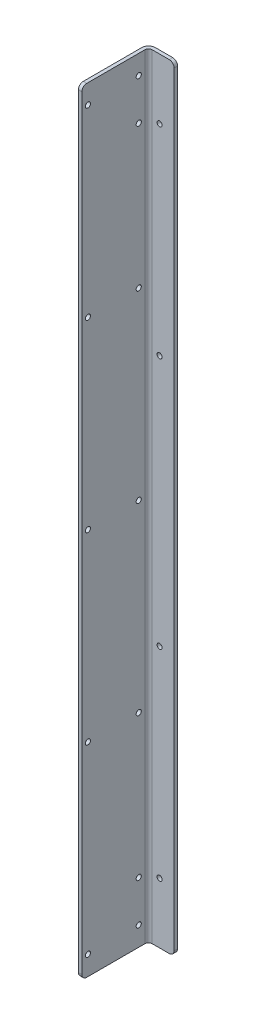
ISO-10303-21;
HEADER;
FILE_DESCRIPTION(('STEP AP214'),'2;1');
FILE_NAME('part.step','',(''),(''),'','','');
FILE_SCHEMA(('AUTOMOTIVE_DESIGN { 1 0 10303 214 1 1 1 1 }'));
ENDSEC;
DATA;
#1=APPLICATION_CONTEXT('core data for automotive mechanical design processes');
#2=APPLICATION_PROTOCOL_DEFINITION('international standard','automotive_design',2000,#1);
#3=PRODUCT_CONTEXT('',#1,'mechanical');
#4=PRODUCT('Part','Part','',(#3));
#5=PRODUCT_RELATED_PRODUCT_CATEGORY('part','',(#4));
#6=PRODUCT_DEFINITION_FORMATION('','',#4);
#7=PRODUCT_DEFINITION_CONTEXT('part definition',#1,'design');
#8=PRODUCT_DEFINITION('design','',#6,#7);
#9=PRODUCT_DEFINITION_SHAPE('','',#8);
#10=(LENGTH_UNIT() NAMED_UNIT(*) SI_UNIT(.MILLI.,.METRE.));
#11=(NAMED_UNIT(*) PLANE_ANGLE_UNIT() SI_UNIT($,.RADIAN.));
#12=(NAMED_UNIT(*) SI_UNIT($,.STERADIAN.) SOLID_ANGLE_UNIT());
#13=UNCERTAINTY_MEASURE_WITH_UNIT(LENGTH_MEASURE(1.E-05),#10,'distance_accuracy_value','');
#14=(GEOMETRIC_REPRESENTATION_CONTEXT(3) GLOBAL_UNCERTAINTY_ASSIGNED_CONTEXT((#13)) GLOBAL_UNIT_ASSIGNED_CONTEXT((#10,
#11,#12)) REPRESENTATION_CONTEXT('',''));
#15=CARTESIAN_POINT('',(0.,0.,0.));
#16=DIRECTION('',(0.,0.,1.));
#17=DIRECTION('',(1.,0.,0.));
#18=AXIS2_PLACEMENT_3D('',#15,#16,#17);
#19=CARTESIAN_POINT('',(19.05,165.1,0.));
#20=DIRECTION('',(0.,0.,-1.));
#21=DIRECTION('',(-1.,0.,0.));
#22=AXIS2_PLACEMENT_3D('',#19,#20,#21);
#23=CYLINDRICAL_SURFACE('',#22,3.3655);
#24=CARTESIAN_POINT('',(19.05,165.1,4.55422));
#25=DIRECTION('',(0.,0.,-1.));
#26=DIRECTION('',(-1.,0.,0.));
#27=AXIS2_PLACEMENT_3D('',#24,#25,#26);
#28=CIRCLE('',#27,3.3655);
#29=CARTESIAN_POINT('',(15.6845,165.1,4.55422));
#30=VERTEX_POINT('',#29);
#31=EDGE_CURVE('E249',#30,#30,#28,.T.);
#32=ORIENTED_EDGE('',*,*,#31,.F.);
#33=EDGE_LOOP('',(#32));
#34=FACE_BOUND('',#33,.T.);
#35=CARTESIAN_POINT('',(19.05,165.1,0.));
#36=DIRECTION('',(0.,0.,-1.));
#37=DIRECTION('',(-1.,0.,0.));
#38=AXIS2_PLACEMENT_3D('',#35,#36,#37);
#39=CIRCLE('',#38,3.3655);
#40=CARTESIAN_POINT('',(15.6845,165.1,0.));
#41=VERTEX_POINT('',#40);
#42=EDGE_CURVE('E120',#41,#41,#39,.F.);
#43=ORIENTED_EDGE('',*,*,#42,.F.);
#44=EDGE_LOOP('',(#43));
#45=FACE_BOUND('',#44,.T.);
#46=ADVANCED_FACE('F17',(#34,#45),#23,.F.);
#47=CARTESIAN_POINT('',(19.05,428.625,0.));
#48=DIRECTION('',(0.,0.,1.));
#49=DIRECTION('',(1.,0.,0.));
#50=AXIS2_PLACEMENT_3D('',#47,#48,#49);
#51=CYLINDRICAL_SURFACE('',#50,3.3655);
#52=CARTESIAN_POINT('',(19.05,428.625,0.));
#53=DIRECTION('',(0.,0.,1.));
#54=DIRECTION('',(1.,0.,0.));
#55=AXIS2_PLACEMENT_3D('',#52,#53,#54);
#56=CIRCLE('',#55,3.3655);
#57=CARTESIAN_POINT('',(22.4155,428.625,0.));
#58=VERTEX_POINT('',#57);
#59=EDGE_CURVE('E260',#58,#58,#56,.T.);
#60=ORIENTED_EDGE('',*,*,#59,.F.);
#61=EDGE_LOOP('',(#60));
#62=FACE_BOUND('',#61,.T.);
#63=CARTESIAN_POINT('',(19.05,428.625,4.55422));
#64=DIRECTION('',(0.,0.,1.));
#65=DIRECTION('',(1.,0.,0.));
#66=AXIS2_PLACEMENT_3D('',#63,#64,#65);
#67=CIRCLE('',#66,3.3655);
#68=CARTESIAN_POINT('',(22.4155,428.625,4.55422));
#69=VERTEX_POINT('',#68);
#70=EDGE_CURVE('E246',#69,#69,#67,.F.);
#71=ORIENTED_EDGE('',*,*,#70,.F.);
#72=EDGE_LOOP('',(#71));
#73=FACE_BOUND('',#72,.T.);
#74=ADVANCED_FACE('F267',(#62,#73),#51,.F.);
#75=CARTESIAN_POINT('',(19.05,-165.1,0.));
#76=DIRECTION('',(0.,0.,1.));
#77=DIRECTION('',(1.,0.,0.));
#78=AXIS2_PLACEMENT_3D('',#75,#76,#77);
#79=CYLINDRICAL_SURFACE('',#78,3.3655);
#80=CARTESIAN_POINT('',(19.05,-165.1,0.));
#81=DIRECTION('',(0.,0.,1.));
#82=DIRECTION('',(1.,0.,0.));
#83=AXIS2_PLACEMENT_3D('',#80,#81,#82);
#84=CIRCLE('',#83,3.3655);
#85=CARTESIAN_POINT('',(22.4155,-165.1,0.));
#86=VERTEX_POINT('',#85);
#87=EDGE_CURVE('E257',#86,#86,#84,.T.);
#88=ORIENTED_EDGE('',*,*,#87,.F.);
#89=EDGE_LOOP('',(#88));
#90=FACE_BOUND('',#89,.T.);
#91=CARTESIAN_POINT('',(19.05,-165.1,4.55422));
#92=DIRECTION('',(0.,0.,1.));
#93=DIRECTION('',(1.,0.,0.));
#94=AXIS2_PLACEMENT_3D('',#91,#92,#93);
#95=CIRCLE('',#94,3.3655);
#96=CARTESIAN_POINT('',(22.4155,-165.1,4.55422));
#97=VERTEX_POINT('',#96);
#98=EDGE_CURVE('E243',#97,#97,#95,.F.);
#99=ORIENTED_EDGE('',*,*,#98,.F.);
#100=EDGE_LOOP('',(#99));
#101=FACE_BOUND('',#100,.T.);
#102=ADVANCED_FACE('F273',(#90,#101),#79,.F.);
#103=CARTESIAN_POINT('',(19.05,-428.625,0.));
#104=DIRECTION('',(0.,0.,-1.));
#105=DIRECTION('',(-1.,0.,0.));
#106=AXIS2_PLACEMENT_3D('',#103,#104,#105);
#107=CYLINDRICAL_SURFACE('',#106,3.3655);
#108=CARTESIAN_POINT('',(19.05,-428.625,4.55422));
#109=DIRECTION('',(0.,0.,-1.));
#110=DIRECTION('',(-1.,0.,0.));
#111=AXIS2_PLACEMENT_3D('',#108,#109,#110);
#112=CIRCLE('',#111,3.3655);
#113=CARTESIAN_POINT('',(15.6845,-428.625,4.55422));
#114=VERTEX_POINT('',#113);
#115=EDGE_CURVE('E240',#114,#114,#112,.T.);
#116=ORIENTED_EDGE('',*,*,#115,.F.);
#117=EDGE_LOOP('',(#116));
#118=FACE_BOUND('',#117,.T.);
#119=CARTESIAN_POINT('',(19.05,-428.625,0.));
#120=DIRECTION('',(0.,0.,-1.));
#121=DIRECTION('',(-1.,0.,0.));
#122=AXIS2_PLACEMENT_3D('',#119,#120,#121);
#123=CIRCLE('',#122,3.3655);
#124=CARTESIAN_POINT('',(15.6845,-428.625,0.));
#125=VERTEX_POINT('',#124);
#126=EDGE_CURVE('E254',#125,#125,#123,.F.);
#127=ORIENTED_EDGE('',*,*,#126,.F.);
#128=EDGE_LOOP('',(#127));
#129=FACE_BOUND('',#128,.T.);
#130=ADVANCED_FACE('F378',(#118,#129),#107,.F.);
#131=CARTESIAN_POINT('',(38.1,-508.,4.55422));
#132=DIRECTION('',(1.,0.,0.));
#133=DIRECTION('',(0.,0.,-1.));
#134=AXIS2_PLACEMENT_3D('',#131,#132,#133);
#135=PLANE('',#134);
#136=DIRECTION('',(0.,1.,0.));
#137=VECTOR('',#136,1.);
#138=CARTESIAN_POINT('',(38.1,-508.,0.));
#139=LINE('',#138,#137);
#140=CARTESIAN_POINT('',(38.1,501.65,0.));
#141=VERTEX_POINT('',#140);
#142=CARTESIAN_POINT('',(38.1,-501.65,0.));
#143=VERTEX_POINT('',#142);
#144=EDGE_CURVE('E107',#141,#143,#139,.F.);
#145=ORIENTED_EDGE('',*,*,#144,.F.);
#146=DIRECTION('',(0.,0.,-1.));
#147=VECTOR('',#146,1.);
#148=CARTESIAN_POINT('',(38.1,501.65,212.10397));
#149=LINE('',#148,#147);
#150=CARTESIAN_POINT('',(38.1,501.65,4.55422));
#151=VERTEX_POINT('',#150);
#152=EDGE_CURVE('E133',#151,#141,#149,.T.);
#153=ORIENTED_EDGE('',*,*,#152,.F.);
#154=DIRECTION('',(0.,1.,0.));
#155=VECTOR('',#154,1.);
#156=CARTESIAN_POINT('',(38.1,-508.,4.55422));
#157=LINE('',#156,#155);
#158=CARTESIAN_POINT('',(38.1,-501.65,4.55422));
#159=VERTEX_POINT('',#158);
#160=EDGE_CURVE('E109',#159,#151,#157,.T.);
#161=ORIENTED_EDGE('',*,*,#160,.F.);
#162=DIRECTION('',(0.,0.,1.));
#163=VECTOR('',#162,1.);
#164=CARTESIAN_POINT('',(38.1,-501.65,-120.02897));
#165=LINE('',#164,#163);
#166=EDGE_CURVE('E102',#143,#159,#165,.T.);
#167=ORIENTED_EDGE('',*,*,#166,.F.);
#168=EDGE_LOOP('',(#145,#153,#161,#167));
#169=FACE_BOUND('',#168,.T.);
#170=ADVANCED_FACE('F104',(#169),#135,.T.);
#171=CARTESIAN_POINT('',(31.75,-501.65,-120.02897));
#172=DIRECTION('',(0.,0.,1.));
#173=DIRECTION('',(1.,0.,0.));
#174=AXIS2_PLACEMENT_3D('',#171,#172,#173);
#175=CYLINDRICAL_SURFACE('',#174,6.35);
#176=ORIENTED_EDGE('',*,*,#166,.T.);
#177=CARTESIAN_POINT('',(31.75,-501.65,4.55422));
#178=DIRECTION('',(0.,0.,1.));
#179=DIRECTION('',(1.,0.,0.));
#180=AXIS2_PLACEMENT_3D('',#177,#178,#179);
#181=CIRCLE('',#180,6.35);
#182=CARTESIAN_POINT('',(31.75,-508.,4.55422));
#183=VERTEX_POINT('',#182);
#184=EDGE_CURVE('E252',#183,#159,#181,.T.);
#185=ORIENTED_EDGE('',*,*,#184,.F.);
#186=DIRECTION('',(0.,0.,1.));
#187=VECTOR('',#186,1.);
#188=CARTESIAN_POINT('',(31.75,-508.,0.));
#189=LINE('',#188,#187);
#190=CARTESIAN_POINT('',(31.75,-508.,0.));
#191=VERTEX_POINT('',#190);
#192=EDGE_CURVE('E117',#183,#191,#189,.F.);
#193=ORIENTED_EDGE('',*,*,#192,.T.);
#194=CARTESIAN_POINT('',(31.75,-501.65,0.));
#195=DIRECTION('',(0.,0.,1.));
#196=DIRECTION('',(1.,0.,0.));
#197=AXIS2_PLACEMENT_3D('',#194,#195,#196);
#198=CIRCLE('',#197,6.35);
#199=EDGE_CURVE('E20',#143,#191,#198,.F.);
#200=ORIENTED_EDGE('',*,*,#199,.F.);
#201=EDGE_LOOP('',(#176,#185,#193,#200));
#202=FACE_BOUND('',#201,.T.);
#203=ADVANCED_FACE('F115',(#202),#175,.T.);
#204=CARTESIAN_POINT('',(38.1,-508.,0.));
#205=DIRECTION('',(0.,0.,-1.));
#206=DIRECTION('',(-1.,0.,0.));
#207=AXIS2_PLACEMENT_3D('',#204,#205,#206);
#208=PLANE('',#207);
#209=ORIENTED_EDGE('',*,*,#126,.T.);
#210=EDGE_LOOP('',(#209));
#211=FACE_BOUND('',#210,.T.);
#212=ORIENTED_EDGE('',*,*,#87,.T.);
#213=EDGE_LOOP('',(#212));
#214=FACE_BOUND('',#213,.T.);
#215=ORIENTED_EDGE('',*,*,#59,.T.);
#216=EDGE_LOOP('',(#215));
#217=FACE_BOUND('',#216,.T.);
#218=ORIENTED_EDGE('',*,*,#42,.T.);
#219=EDGE_LOOP('',(#218));
#220=FACE_BOUND('',#219,.T.);
#221=DIRECTION('',(1.,0.,0.));
#222=VECTOR('',#221,1.);
#223=CARTESIAN_POINT('',(0.,508.,0.));
#224=LINE('',#223,#222);
#225=CARTESIAN_POINT('',(31.75,508.,0.));
#226=VERTEX_POINT('',#225);
#227=CARTESIAN_POINT('',(9.1186,508.,0.));
#228=VERTEX_POINT('',#227);
#229=EDGE_CURVE('E225',#226,#228,#224,.F.);
#230=ORIENTED_EDGE('',*,*,#229,.F.);
#231=CARTESIAN_POINT('',(31.75,501.65,0.));
#232=DIRECTION('',(0.,0.,-1.));
#233=DIRECTION('',(-1.,0.,0.));
#234=AXIS2_PLACEMENT_3D('',#231,#232,#233);
#235=CIRCLE('',#234,6.35);
#236=EDGE_CURVE('E123',#141,#226,#235,.F.);
#237=ORIENTED_EDGE('',*,*,#236,.F.);
#238=ORIENTED_EDGE('',*,*,#144,.T.);
#239=ORIENTED_EDGE('',*,*,#199,.T.);
#240=DIRECTION('',(1.,0.,0.));
#241=VECTOR('',#240,1.);
#242=CARTESIAN_POINT('',(0.,-508.,0.));
#243=LINE('',#242,#241);
#244=CARTESIAN_POINT('',(9.1186,-508.,0.));
#245=VERTEX_POINT('',#244);
#246=EDGE_CURVE('E131',#191,#245,#243,.F.);
#247=ORIENTED_EDGE('',*,*,#246,.T.);
#248=DIRECTION('',(0.,-1.,0.));
#249=VECTOR('',#248,1.);
#250=CARTESIAN_POINT('',(9.1186,1832.4576,0.));
#251=LINE('',#250,#249);
#252=EDGE_CURVE('E128',#228,#245,#251,.T.);
#253=ORIENTED_EDGE('',*,*,#252,.F.);
#254=EDGE_LOOP('',(#230,#237,#238,#239,#247,#253));
#255=FACE_BOUND('',#254,.T.);
#256=ADVANCED_FACE('F121',(#211,#214,#217,#220,#255),#208,.T.);
#257=CARTESIAN_POINT('',(9.1186,1832.4576,9.1186));
#258=DIRECTION('',(0.,-1.,0.));
#259=DIRECTION('',(0.,0.,-1.));
#260=AXIS2_PLACEMENT_3D('',#257,#258,#259);
#261=CYLINDRICAL_SURFACE('',#260,9.1186);
#262=ORIENTED_EDGE('',*,*,#252,.T.);
#263=CARTESIAN_POINT('',(9.1186,-508.,9.1186));
#264=DIRECTION('',(0.,-1.,0.));
#265=DIRECTION('',(0.,0.,-1.));
#266=AXIS2_PLACEMENT_3D('',#263,#264,#265);
#267=CIRCLE('',#266,9.1186);
#268=CARTESIAN_POINT('',(0.,-508.,9.1186));
#269=VERTEX_POINT('',#268);
#270=EDGE_CURVE('E229',#245,#269,#267,.F.);
#271=ORIENTED_EDGE('',*,*,#270,.T.);
#272=DIRECTION('',(0.,1.,0.));
#273=VECTOR('',#272,1.);
#274=CARTESIAN_POINT('',(0.,-508.,9.1186));
#275=LINE('',#274,#273);
#276=CARTESIAN_POINT('',(0.,508.,9.1186));
#277=VERTEX_POINT('',#276);
#278=EDGE_CURVE('E237',#277,#269,#275,.F.);
#279=ORIENTED_EDGE('',*,*,#278,.F.);
#280=CARTESIAN_POINT('',(9.1186,508.,9.1186));
#281=DIRECTION('',(0.,-1.,0.));
#282=DIRECTION('',(0.,0.,-1.));
#283=AXIS2_PLACEMENT_3D('',#280,#281,#282);
#284=CIRCLE('',#283,9.1186);
#285=EDGE_CURVE('E222',#228,#277,#284,.F.);
#286=ORIENTED_EDGE('',*,*,#285,.F.);
#287=EDGE_LOOP('',(#262,#271,#279,#286));
#288=FACE_BOUND('',#287,.T.);
#289=ADVANCED_FACE('F366',(#288),#261,.T.);
#290=CARTESIAN_POINT('',(4.55422,-508.,4.55422));
#291=DIRECTION('',(0.,0.,1.));
#292=DIRECTION('',(1.,0.,0.));
#293=AXIS2_PLACEMENT_3D('',#290,#291,#292);
#294=PLANE('',#293);
#295=ORIENTED_EDGE('',*,*,#115,.T.);
#296=EDGE_LOOP('',(#295));
#297=FACE_BOUND('',#296,.T.);
#298=ORIENTED_EDGE('',*,*,#98,.T.);
#299=EDGE_LOOP('',(#298));
#300=FACE_BOUND('',#299,.T.);
#301=ORIENTED_EDGE('',*,*,#70,.T.);
#302=EDGE_LOOP('',(#301));
#303=FACE_BOUND('',#302,.T.);
#304=ORIENTED_EDGE('',*,*,#31,.T.);
#305=EDGE_LOOP('',(#304));
#306=FACE_BOUND('',#305,.T.);
#307=ORIENTED_EDGE('',*,*,#160,.T.);
#308=CARTESIAN_POINT('',(31.75,501.65,4.55422));
#309=DIRECTION('',(0.,0.,-1.));
#310=DIRECTION('',(-1.,0.,0.));
#311=AXIS2_PLACEMENT_3D('',#308,#309,#310);
#312=CIRCLE('',#311,6.35);
#313=CARTESIAN_POINT('',(31.75,508.,4.55422));
#314=VERTEX_POINT('',#313);
#315=EDGE_CURVE('E134',#314,#151,#312,.T.);
#316=ORIENTED_EDGE('',*,*,#315,.F.);
#317=DIRECTION('',(1.,0.,0.));
#318=VECTOR('',#317,1.);
#319=CARTESIAN_POINT('',(0.,508.,4.55422));
#320=LINE('',#319,#318);
#321=CARTESIAN_POINT('',(9.10844,508.,4.55422));
#322=VERTEX_POINT('',#321);
#323=EDGE_CURVE('E220',#322,#314,#320,.T.);
#324=ORIENTED_EDGE('',*,*,#323,.F.);
#325=DIRECTION('',(0.,1.,0.));
#326=VECTOR('',#325,1.);
#327=CARTESIAN_POINT('',(9.10844,-1832.4576,4.55422));
#328=LINE('',#327,#326);
#329=CARTESIAN_POINT('',(9.10844,-508.,4.55422));
#330=VERTEX_POINT('',#329);
#331=EDGE_CURVE('E228',#322,#330,#328,.F.);
#332=ORIENTED_EDGE('',*,*,#331,.T.);
#333=DIRECTION('',(1.,0.,0.));
#334=VECTOR('',#333,1.);
#335=CARTESIAN_POINT('',(0.,-508.,4.55422));
#336=LINE('',#335,#334);
#337=EDGE_CURVE('E132',#330,#183,#336,.T.);
#338=ORIENTED_EDGE('',*,*,#337,.T.);
#339=ORIENTED_EDGE('',*,*,#184,.T.);
#340=EDGE_LOOP('',(#307,#316,#324,#332,#338,#339));
#341=FACE_BOUND('',#340,.T.);
#342=ADVANCED_FACE('F362',(#297,#300,#303,#306,#341),#294,.T.);
#343=CARTESIAN_POINT('',(31.75,501.65,212.10397));
#344=DIRECTION('',(0.,0.,-1.));
#345=DIRECTION('',(-1.,0.,0.));
#346=AXIS2_PLACEMENT_3D('',#343,#344,#345);
#347=CYLINDRICAL_SURFACE('',#346,6.35);
#348=ORIENTED_EDGE('',*,*,#152,.T.);
#349=ORIENTED_EDGE('',*,*,#236,.T.);
#350=DIRECTION('',(0.,0.,1.));
#351=VECTOR('',#350,1.);
#352=CARTESIAN_POINT('',(31.75,508.,0.));
#353=LINE('',#352,#351);
#354=EDGE_CURVE('E399',#314,#226,#353,.F.);
#355=ORIENTED_EDGE('',*,*,#354,.F.);
#356=ORIENTED_EDGE('',*,*,#315,.T.);
#357=EDGE_LOOP('',(#348,#349,#355,#356));
#358=FACE_BOUND('',#357,.T.);
#359=ADVANCED_FACE('F358',(#358),#347,.T.);
#360=CARTESIAN_POINT('',(0.,-508.,0.));
#361=DIRECTION('',(-1.,0.,0.));
#362=DIRECTION('',(0.,0.,1.));
#363=AXIS2_PLACEMENT_3D('',#360,#361,#362);
#364=PLANE('',#363);
#365=CARTESIAN_POINT('',(0.,-482.6,84.1375));
#366=DIRECTION('',(-1.,0.,0.));
#367=DIRECTION('',(0.,0.,1.));
#368=AXIS2_PLACEMENT_3D('',#365,#366,#367);
#369=CIRCLE('',#368,3.3655);
#370=CARTESIAN_POINT('',(0.,-482.6,87.503));
#371=VERTEX_POINT('',#370);
#372=EDGE_CURVE('E177',#371,#371,#369,.F.);
#373=ORIENTED_EDGE('',*,*,#372,.T.);
#374=EDGE_LOOP('',(#373));
#375=FACE_BOUND('',#374,.T.);
#376=CARTESIAN_POINT('',(0.,-428.625,17.4625));
#377=DIRECTION('',(1.,0.,0.));
#378=DIRECTION('',(0.,0.,-1.));
#379=AXIS2_PLACEMENT_3D('',#376,#377,#378);
#380=CIRCLE('',#379,3.3655);
#381=CARTESIAN_POINT('',(0.,-428.625,14.097));
#382=VERTEX_POINT('',#381);
#383=EDGE_CURVE('E180',#382,#382,#380,.T.);
#384=ORIENTED_EDGE('',*,*,#383,.T.);
#385=EDGE_LOOP('',(#384));
#386=FACE_BOUND('',#385,.T.);
#387=CARTESIAN_POINT('',(0.,428.625,17.4625));
#388=DIRECTION('',(-1.,0.,0.));
#389=DIRECTION('',(0.,0.,1.));
#390=AXIS2_PLACEMENT_3D('',#387,#388,#389);
#391=CIRCLE('',#390,3.3655);
#392=CARTESIAN_POINT('',(0.,428.625,20.828));
#393=VERTEX_POINT('',#392);
#394=EDGE_CURVE('E183',#393,#393,#391,.F.);
#395=ORIENTED_EDGE('',*,*,#394,.T.);
#396=EDGE_LOOP('',(#395));
#397=FACE_BOUND('',#396,.T.);
#398=CARTESIAN_POINT('',(0.,482.6,17.4625));
#399=DIRECTION('',(-1.,0.,0.));
#400=DIRECTION('',(0.,0.,1.));
#401=AXIS2_PLACEMENT_3D('',#398,#399,#400);
#402=CIRCLE('',#401,3.3655);
#403=CARTESIAN_POINT('',(0.,482.6,20.828));
#404=VERTEX_POINT('',#403);
#405=EDGE_CURVE('E186',#404,#404,#402,.F.);
#406=ORIENTED_EDGE('',*,*,#405,.T.);
#407=EDGE_LOOP('',(#406));
#408=FACE_BOUND('',#407,.T.);
#409=CARTESIAN_POINT('',(0.,241.3,17.4625));
#410=DIRECTION('',(-1.,0.,0.));
#411=DIRECTION('',(0.,0.,1.));
#412=AXIS2_PLACEMENT_3D('',#409,#410,#411);
#413=CIRCLE('',#412,3.3655);
#414=CARTESIAN_POINT('',(0.,241.3,20.828));
#415=VERTEX_POINT('',#414);
#416=EDGE_CURVE('E189',#415,#415,#413,.F.);
#417=ORIENTED_EDGE('',*,*,#416,.T.);
#418=EDGE_LOOP('',(#417));
#419=FACE_BOUND('',#418,.T.);
#420=CARTESIAN_POINT('',(0.,0.,17.4625));
#421=DIRECTION('',(-1.,0.,0.));
#422=DIRECTION('',(0.,0.,1.));
#423=AXIS2_PLACEMENT_3D('',#420,#421,#422);
#424=CIRCLE('',#423,3.3655);
#425=CARTESIAN_POINT('',(0.,0.,20.828));
#426=VERTEX_POINT('',#425);
#427=EDGE_CURVE('E192',#426,#426,#424,.F.);
#428=ORIENTED_EDGE('',*,*,#427,.T.);
#429=EDGE_LOOP('',(#428));
#430=FACE_BOUND('',#429,.T.);
#431=CARTESIAN_POINT('',(0.,-241.3,17.4625));
#432=DIRECTION('',(-1.,0.,0.));
#433=DIRECTION('',(0.,0.,1.));
#434=AXIS2_PLACEMENT_3D('',#431,#432,#433);
#435=CIRCLE('',#434,3.3655);
#436=CARTESIAN_POINT('',(0.,-241.3,20.828));
#437=VERTEX_POINT('',#436);
#438=EDGE_CURVE('E195',#437,#437,#435,.F.);
#439=ORIENTED_EDGE('',*,*,#438,.T.);
#440=EDGE_LOOP('',(#439));
#441=FACE_BOUND('',#440,.T.);
#442=CARTESIAN_POINT('',(0.,-482.6,17.4625));
#443=DIRECTION('',(-1.,0.,0.));
#444=DIRECTION('',(0.,0.,1.));
#445=AXIS2_PLACEMENT_3D('',#442,#443,#444);
#446=CIRCLE('',#445,3.3655);
#447=CARTESIAN_POINT('',(0.,-482.6,20.828));
#448=VERTEX_POINT('',#447);
#449=EDGE_CURVE('E198',#448,#448,#446,.F.);
#450=ORIENTED_EDGE('',*,*,#449,.T.);
#451=EDGE_LOOP('',(#450));
#452=FACE_BOUND('',#451,.T.);
#453=CARTESIAN_POINT('',(0.,482.6,84.1375));
#454=DIRECTION('',(-1.,0.,0.));
#455=DIRECTION('',(0.,0.,1.));
#456=AXIS2_PLACEMENT_3D('',#453,#454,#455);
#457=CIRCLE('',#456,3.3655);
#458=CARTESIAN_POINT('',(0.,482.6,87.503));
#459=VERTEX_POINT('',#458);
#460=EDGE_CURVE('E201',#459,#459,#457,.F.);
#461=ORIENTED_EDGE('',*,*,#460,.T.);
#462=EDGE_LOOP('',(#461));
#463=FACE_BOUND('',#462,.T.);
#464=CARTESIAN_POINT('',(0.,241.3,84.1375));
#465=DIRECTION('',(-1.,0.,0.));
#466=DIRECTION('',(0.,0.,1.));
#467=AXIS2_PLACEMENT_3D('',#464,#465,#466);
#468=CIRCLE('',#467,3.3655);
#469=CARTESIAN_POINT('',(0.,241.3,87.503));
#470=VERTEX_POINT('',#469);
#471=EDGE_CURVE('E204',#470,#470,#468,.F.);
#472=ORIENTED_EDGE('',*,*,#471,.T.);
#473=EDGE_LOOP('',(#472));
#474=FACE_BOUND('',#473,.T.);
#475=CARTESIAN_POINT('',(0.,0.,84.1375));
#476=DIRECTION('',(-1.,0.,0.));
#477=DIRECTION('',(0.,0.,1.));
#478=AXIS2_PLACEMENT_3D('',#475,#476,#477);
#479=CIRCLE('',#478,3.3655);
#480=CARTESIAN_POINT('',(0.,0.,87.503));
#481=VERTEX_POINT('',#480);
#482=EDGE_CURVE('E207',#481,#481,#479,.F.);
#483=ORIENTED_EDGE('',*,*,#482,.T.);
#484=EDGE_LOOP('',(#483));
#485=FACE_BOUND('',#484,.T.);
#486=CARTESIAN_POINT('',(0.,-241.3,84.1375));
#487=DIRECTION('',(-1.,0.,0.));
#488=DIRECTION('',(0.,0.,1.));
#489=AXIS2_PLACEMENT_3D('',#486,#487,#488);
#490=CIRCLE('',#489,3.3655);
#491=CARTESIAN_POINT('',(0.,-241.3,87.503));
#492=VERTEX_POINT('',#491);
#493=EDGE_CURVE('E210',#492,#492,#490,.F.);
#494=ORIENTED_EDGE('',*,*,#493,.T.);
#495=EDGE_LOOP('',(#494));
#496=FACE_BOUND('',#495,.T.);
#497=DIRECTION('',(0.,1.,0.));
#498=VECTOR('',#497,1.);
#499=CARTESIAN_POINT('',(0.,-508.,92.075));
#500=LINE('',#499,#498);
#501=CARTESIAN_POINT('',(0.,501.65,92.075));
#502=VERTEX_POINT('',#501);
#503=CARTESIAN_POINT('',(0.,-501.65,92.075));
#504=VERTEX_POINT('',#503);
#505=EDGE_CURVE('E419',#502,#504,#500,.F.);
#506=ORIENTED_EDGE('',*,*,#505,.F.);
#507=CARTESIAN_POINT('',(0.,501.65,85.725));
#508=DIRECTION('',(1.,0.,0.));
#509=DIRECTION('',(0.,0.,-1.));
#510=AXIS2_PLACEMENT_3D('',#507,#508,#509);
#511=CIRCLE('',#510,6.35);
#512=CARTESIAN_POINT('',(0.,508.,85.725));
#513=VERTEX_POINT('',#512);
#514=EDGE_CURVE('E214',#513,#502,#511,.T.);
#515=ORIENTED_EDGE('',*,*,#514,.F.);
#516=DIRECTION('',(0.,0.,1.));
#517=VECTOR('',#516,1.);
#518=CARTESIAN_POINT('',(0.,508.,0.));
#519=LINE('',#518,#517);
#520=EDGE_CURVE('E221',#277,#513,#519,.T.);
#521=ORIENTED_EDGE('',*,*,#520,.F.);
#522=ORIENTED_EDGE('',*,*,#278,.T.);
#523=DIRECTION('',(0.,0.,1.));
#524=VECTOR('',#523,1.);
#525=CARTESIAN_POINT('',(0.,-508.,0.));
#526=LINE('',#525,#524);
#527=CARTESIAN_POINT('',(0.,-508.,85.725));
#528=VERTEX_POINT('',#527);
#529=EDGE_CURVE('E231',#269,#528,#526,.T.);
#530=ORIENTED_EDGE('',*,*,#529,.T.);
#531=CARTESIAN_POINT('',(0.,-501.65,85.725));
#532=DIRECTION('',(-1.,0.,0.));
#533=DIRECTION('',(0.,0.,1.));
#534=AXIS2_PLACEMENT_3D('',#531,#532,#533);
#535=CIRCLE('',#534,6.35);
#536=EDGE_CURVE('E232',#504,#528,#535,.F.);
#537=ORIENTED_EDGE('',*,*,#536,.F.);
#538=EDGE_LOOP('',(#506,#515,#521,#522,#530,#537));
#539=FACE_BOUND('',#538,.T.);
#540=ADVANCED_FACE('F354',(#375,#386,#397,#408,#419,#430,#441,#452,#463,#474,#485,#496,#539),
#364,.T.);
#541=CARTESIAN_POINT('',(0.,-508.,92.075));
#542=DIRECTION('',(0.,0.,1.));
#543=DIRECTION('',(1.,0.,0.));
#544=AXIS2_PLACEMENT_3D('',#541,#542,#543);
#545=PLANE('',#544);
#546=DIRECTION('',(0.,1.,0.));
#547=VECTOR('',#546,1.);
#548=CARTESIAN_POINT('',(4.55422,-508.,92.075));
#549=LINE('',#548,#547);
#550=CARTESIAN_POINT('',(4.55422,501.65,92.075));
#551=VERTEX_POINT('',#550);
#552=CARTESIAN_POINT('',(4.55422,-501.65,92.075));
#553=VERTEX_POINT('',#552);
#554=EDGE_CURVE('E176',#551,#553,#549,.F.);
#555=ORIENTED_EDGE('',*,*,#554,.F.);
#556=DIRECTION('',(1.,0.,0.));
#557=VECTOR('',#556,1.);
#558=CARTESIAN_POINT('',(-49.66716,501.65,92.075));
#559=LINE('',#558,#557);
#560=EDGE_CURVE('E213',#502,#551,#559,.T.);
#561=ORIENTED_EDGE('',*,*,#560,.F.);
#562=ORIENTED_EDGE('',*,*,#505,.T.);
#563=DIRECTION('',(-1.,0.,0.));
#564=VECTOR('',#563,1.);
#565=CARTESIAN_POINT('',(87.76716,-501.65,92.075));
#566=LINE('',#565,#564);
#567=EDGE_CURVE('E235',#553,#504,#566,.T.);
#568=ORIENTED_EDGE('',*,*,#567,.F.);
#569=EDGE_LOOP('',(#555,#561,#562,#568));
#570=FACE_BOUND('',#569,.T.);
#571=ADVANCED_FACE('F350',(#570),#545,.T.);
#572=CARTESIAN_POINT('',(87.76716,-501.65,85.725));
#573=DIRECTION('',(-1.,0.,0.));
#574=DIRECTION('',(0.,0.,1.));
#575=AXIS2_PLACEMENT_3D('',#572,#573,#574);
#576=CYLINDRICAL_SURFACE('',#575,6.35);
#577=ORIENTED_EDGE('',*,*,#567,.T.);
#578=ORIENTED_EDGE('',*,*,#536,.T.);
#579=DIRECTION('',(1.,0.,0.));
#580=VECTOR('',#579,1.);
#581=CARTESIAN_POINT('',(0.,-508.,85.725));
#582=LINE('',#581,#580);
#583=CARTESIAN_POINT('',(4.55422,-508.,85.725));
#584=VERTEX_POINT('',#583);
#585=EDGE_CURVE('E234',#528,#584,#582,.T.);
#586=ORIENTED_EDGE('',*,*,#585,.T.);
#587=CARTESIAN_POINT('',(4.55422,-501.65,85.725));
#588=DIRECTION('',(-1.,0.,0.));
#589=DIRECTION('',(0.,0.,1.));
#590=AXIS2_PLACEMENT_3D('',#587,#588,#589);
#591=CIRCLE('',#590,6.35);
#592=EDGE_CURVE('E172',#553,#584,#591,.F.);
#593=ORIENTED_EDGE('',*,*,#592,.F.);
#594=EDGE_LOOP('',(#577,#578,#586,#593));
#595=FACE_BOUND('',#594,.T.);
#596=ADVANCED_FACE('F346',(#595),#576,.T.);
#597=CARTESIAN_POINT('',(0.,-508.,0.));
#598=DIRECTION('',(0.,1.,0.));
#599=DIRECTION('',(0.,0.,1.));
#600=AXIS2_PLACEMENT_3D('',#597,#598,#599);
#601=PLANE('',#600);
#602=ORIENTED_EDGE('',*,*,#270,.F.);
#603=ORIENTED_EDGE('',*,*,#246,.F.);
#604=ORIENTED_EDGE('',*,*,#192,.F.);
#605=ORIENTED_EDGE('',*,*,#337,.F.);
#606=CARTESIAN_POINT('',(9.10844,-508.,9.10844));
#607=DIRECTION('',(0.,1.,0.));
#608=DIRECTION('',(0.,0.,1.));
#609=AXIS2_PLACEMENT_3D('',#606,#607,#608);
#610=CIRCLE('',#609,4.55422);
#611=CARTESIAN_POINT('',(4.55422,-508.,9.10844));
#612=VERTEX_POINT('',#611);
#613=EDGE_CURVE('E226',#330,#612,#610,.T.);
#614=ORIENTED_EDGE('',*,*,#613,.T.);
#615=DIRECTION('',(0.,0.,-1.));
#616=VECTOR('',#615,1.);
#617=CARTESIAN_POINT('',(4.55422,-508.,92.075));
#618=LINE('',#617,#616);
#619=EDGE_CURVE('E175',#584,#612,#618,.T.);
#620=ORIENTED_EDGE('',*,*,#619,.F.);
#621=ORIENTED_EDGE('',*,*,#585,.F.);
#622=ORIENTED_EDGE('',*,*,#529,.F.);
#623=EDGE_LOOP('',(#602,#603,#604,#605,#614,#620,#621,#622));
#624=FACE_BOUND('',#623,.T.);
#625=ADVANCED_FACE('F342',(#624),#601,.F.);
#626=CARTESIAN_POINT('',(9.10844,-1832.4576,9.10844));
#627=DIRECTION('',(0.,1.,0.));
#628=DIRECTION('',(0.,0.,1.));
#629=AXIS2_PLACEMENT_3D('',#626,#627,#628);
#630=CYLINDRICAL_SURFACE('',#629,4.55422);
#631=DIRECTION('',(0.,1.,0.));
#632=VECTOR('',#631,1.);
#633=CARTESIAN_POINT('',(4.55422,-508.,9.10843999999999));
#634=LINE('',#633,#632);
#635=CARTESIAN_POINT('',(4.55422,508.,9.10844));
#636=VERTEX_POINT('',#635);
#637=EDGE_CURVE('E409',#612,#636,#634,.T.);
#638=ORIENTED_EDGE('',*,*,#637,.F.);
#639=ORIENTED_EDGE('',*,*,#613,.F.);
#640=ORIENTED_EDGE('',*,*,#331,.F.);
#641=CARTESIAN_POINT('',(9.10844,508.,9.10844));
#642=DIRECTION('',(0.,1.,0.));
#643=DIRECTION('',(0.,0.,1.));
#644=AXIS2_PLACEMENT_3D('',#641,#642,#643);
#645=CIRCLE('',#644,4.55422);
#646=EDGE_CURVE('E217',#636,#322,#645,.F.);
#647=ORIENTED_EDGE('',*,*,#646,.F.);
#648=EDGE_LOOP('',(#638,#639,#640,#647));
#649=FACE_BOUND('',#648,.T.);
#650=ADVANCED_FACE('F339',(#649),#630,.F.);
#651=CARTESIAN_POINT('',(0.,508.,0.));
#652=DIRECTION('',(0.,1.,0.));
#653=DIRECTION('',(0.,0.,1.));
#654=AXIS2_PLACEMENT_3D('',#651,#652,#653);
#655=PLANE('',#654);
#656=ORIENTED_EDGE('',*,*,#323,.T.);
#657=ORIENTED_EDGE('',*,*,#354,.T.);
#658=ORIENTED_EDGE('',*,*,#229,.T.);
#659=ORIENTED_EDGE('',*,*,#285,.T.);
#660=ORIENTED_EDGE('',*,*,#520,.T.);
#661=DIRECTION('',(1.,0.,0.));
#662=VECTOR('',#661,1.);
#663=CARTESIAN_POINT('',(-49.66716,508.,85.725));
#664=LINE('',#663,#662);
#665=CARTESIAN_POINT('',(4.55422,508.,85.725));
#666=VERTEX_POINT('',#665);
#667=EDGE_CURVE('E35',#666,#513,#664,.F.);
#668=ORIENTED_EDGE('',*,*,#667,.F.);
#669=DIRECTION('',(0.,0.,-1.));
#670=VECTOR('',#669,1.);
#671=CARTESIAN_POINT('',(4.55422,508.,92.075));
#672=LINE('',#671,#670);
#673=EDGE_CURVE('E171',#636,#666,#672,.F.);
#674=ORIENTED_EDGE('',*,*,#673,.F.);
#675=ORIENTED_EDGE('',*,*,#646,.T.);
#676=EDGE_LOOP('',(#656,#657,#658,#659,#660,#668,#674,#675));
#677=FACE_BOUND('',#676,.T.);
#678=ADVANCED_FACE('F335',(#677),#655,.T.);
#679=CARTESIAN_POINT('',(-49.66716,501.65,85.725));
#680=DIRECTION('',(1.,0.,0.));
#681=DIRECTION('',(0.,0.,-1.));
#682=AXIS2_PLACEMENT_3D('',#679,#680,#681);
#683=CYLINDRICAL_SURFACE('',#682,6.35);
#684=ORIENTED_EDGE('',*,*,#560,.T.);
#685=CARTESIAN_POINT('',(4.55422,501.65,85.725));
#686=DIRECTION('',(1.,0.,0.));
#687=DIRECTION('',(0.,0.,-1.));
#688=AXIS2_PLACEMENT_3D('',#685,#686,#687);
#689=CIRCLE('',#688,6.35);
#690=EDGE_CURVE('E168',#666,#551,#689,.T.);
#691=ORIENTED_EDGE('',*,*,#690,.F.);
#692=ORIENTED_EDGE('',*,*,#667,.T.);
#693=ORIENTED_EDGE('',*,*,#514,.T.);
#694=EDGE_LOOP('',(#684,#691,#692,#693));
#695=FACE_BOUND('',#694,.T.);
#696=ADVANCED_FACE('F331',(#695),#683,.T.);
#697=CARTESIAN_POINT('',(0.,-241.3,84.1375));
#698=DIRECTION('',(-1.,0.,0.));
#699=DIRECTION('',(0.,0.,1.));
#700=AXIS2_PLACEMENT_3D('',#697,#698,#699);
#701=CYLINDRICAL_SURFACE('',#700,3.3655);
#702=CARTESIAN_POINT('',(4.55422,-241.3,84.1375));
#703=DIRECTION('',(-1.,0.,0.));
#704=DIRECTION('',(0.,0.,1.));
#705=AXIS2_PLACEMENT_3D('',#702,#703,#704);
#706=CIRCLE('',#705,3.3655);
#707=CARTESIAN_POINT('',(4.55422,-241.3,87.503));
#708=VERTEX_POINT('',#707);
#709=EDGE_CURVE('E165',#708,#708,#706,.T.);
#710=ORIENTED_EDGE('',*,*,#709,.F.);
#711=EDGE_LOOP('',(#710));
#712=FACE_BOUND('',#711,.T.);
#713=ORIENTED_EDGE('',*,*,#493,.F.);
#714=EDGE_LOOP('',(#713));
#715=FACE_BOUND('',#714,.T.);
#716=ADVANCED_FACE('F327',(#712,#715),#701,.F.);
#717=CARTESIAN_POINT('',(0.,0.,84.1375));
#718=DIRECTION('',(-1.,0.,0.));
#719=DIRECTION('',(0.,0.,1.));
#720=AXIS2_PLACEMENT_3D('',#717,#718,#719);
#721=CYLINDRICAL_SURFACE('',#720,3.3655);
#722=CARTESIAN_POINT('',(4.55422,0.,84.1375));
#723=DIRECTION('',(-1.,0.,0.));
#724=DIRECTION('',(0.,0.,1.));
#725=AXIS2_PLACEMENT_3D('',#722,#723,#724);
#726=CIRCLE('',#725,3.3655);
#727=CARTESIAN_POINT('',(4.55422,0.,87.503));
#728=VERTEX_POINT('',#727);
#729=EDGE_CURVE('E162',#728,#728,#726,.T.);
#730=ORIENTED_EDGE('',*,*,#729,.F.);
#731=EDGE_LOOP('',(#730));
#732=FACE_BOUND('',#731,.T.);
#733=ORIENTED_EDGE('',*,*,#482,.F.);
#734=EDGE_LOOP('',(#733));
#735=FACE_BOUND('',#734,.T.);
#736=ADVANCED_FACE('F323',(#732,#735),#721,.F.);
#737=CARTESIAN_POINT('',(0.,241.3,84.1375));
#738=DIRECTION('',(-1.,0.,0.));
#739=DIRECTION('',(0.,0.,1.));
#740=AXIS2_PLACEMENT_3D('',#737,#738,#739);
#741=CYLINDRICAL_SURFACE('',#740,3.3655);
#742=CARTESIAN_POINT('',(4.55422,241.3,84.1375));
#743=DIRECTION('',(-1.,0.,0.));
#744=DIRECTION('',(0.,0.,1.));
#745=AXIS2_PLACEMENT_3D('',#742,#743,#744);
#746=CIRCLE('',#745,3.3655);
#747=CARTESIAN_POINT('',(4.55422,241.3,87.503));
#748=VERTEX_POINT('',#747);
#749=EDGE_CURVE('E159',#748,#748,#746,.T.);
#750=ORIENTED_EDGE('',*,*,#749,.F.);
#751=EDGE_LOOP('',(#750));
#752=FACE_BOUND('',#751,.T.);
#753=ORIENTED_EDGE('',*,*,#471,.F.);
#754=EDGE_LOOP('',(#753));
#755=FACE_BOUND('',#754,.T.);
#756=ADVANCED_FACE('F319',(#752,#755),#741,.F.);
#757=CARTESIAN_POINT('',(0.,482.6,84.1375));
#758=DIRECTION('',(-1.,0.,0.));
#759=DIRECTION('',(0.,0.,1.));
#760=AXIS2_PLACEMENT_3D('',#757,#758,#759);
#761=CYLINDRICAL_SURFACE('',#760,3.3655);
#762=CARTESIAN_POINT('',(4.55422,482.6,84.1375));
#763=DIRECTION('',(-1.,0.,0.));
#764=DIRECTION('',(0.,0.,1.));
#765=AXIS2_PLACEMENT_3D('',#762,#763,#764);
#766=CIRCLE('',#765,3.3655);
#767=CARTESIAN_POINT('',(4.55422,482.6,87.503));
#768=VERTEX_POINT('',#767);
#769=EDGE_CURVE('E156',#768,#768,#766,.T.);
#770=ORIENTED_EDGE('',*,*,#769,.F.);
#771=EDGE_LOOP('',(#770));
#772=FACE_BOUND('',#771,.T.);
#773=ORIENTED_EDGE('',*,*,#460,.F.);
#774=EDGE_LOOP('',(#773));
#775=FACE_BOUND('',#774,.T.);
#776=ADVANCED_FACE('F315',(#772,#775),#761,.F.);
#777=CARTESIAN_POINT('',(0.,-482.6,17.4625));
#778=DIRECTION('',(-1.,0.,0.));
#779=DIRECTION('',(0.,0.,1.));
#780=AXIS2_PLACEMENT_3D('',#777,#778,#779);
#781=CYLINDRICAL_SURFACE('',#780,3.3655);
#782=CARTESIAN_POINT('',(4.55422,-482.6,17.4625));
#783=DIRECTION('',(-1.,0.,0.));
#784=DIRECTION('',(0.,0.,1.));
#785=AXIS2_PLACEMENT_3D('',#782,#783,#784);
#786=CIRCLE('',#785,3.3655);
#787=CARTESIAN_POINT('',(4.55422,-482.6,20.828));
#788=VERTEX_POINT('',#787);
#789=EDGE_CURVE('E153',#788,#788,#786,.T.);
#790=ORIENTED_EDGE('',*,*,#789,.F.);
#791=EDGE_LOOP('',(#790));
#792=FACE_BOUND('',#791,.T.);
#793=ORIENTED_EDGE('',*,*,#449,.F.);
#794=EDGE_LOOP('',(#793));
#795=FACE_BOUND('',#794,.T.);
#796=ADVANCED_FACE('F311',(#792,#795),#781,.F.);
#797=CARTESIAN_POINT('',(0.,-241.3,17.4625));
#798=DIRECTION('',(-1.,0.,0.));
#799=DIRECTION('',(0.,0.,1.));
#800=AXIS2_PLACEMENT_3D('',#797,#798,#799);
#801=CYLINDRICAL_SURFACE('',#800,3.3655);
#802=CARTESIAN_POINT('',(4.55422,-241.3,17.4625));
#803=DIRECTION('',(-1.,0.,0.));
#804=DIRECTION('',(0.,0.,1.));
#805=AXIS2_PLACEMENT_3D('',#802,#803,#804);
#806=CIRCLE('',#805,3.3655);
#807=CARTESIAN_POINT('',(4.55422,-241.3,20.828));
#808=VERTEX_POINT('',#807);
#809=EDGE_CURVE('E150',#808,#808,#806,.T.);
#810=ORIENTED_EDGE('',*,*,#809,.F.);
#811=EDGE_LOOP('',(#810));
#812=FACE_BOUND('',#811,.T.);
#813=ORIENTED_EDGE('',*,*,#438,.F.);
#814=EDGE_LOOP('',(#813));
#815=FACE_BOUND('',#814,.T.);
#816=ADVANCED_FACE('F307',(#812,#815),#801,.F.);
#817=CARTESIAN_POINT('',(0.,0.,17.4625));
#818=DIRECTION('',(-1.,0.,0.));
#819=DIRECTION('',(0.,0.,1.));
#820=AXIS2_PLACEMENT_3D('',#817,#818,#819);
#821=CYLINDRICAL_SURFACE('',#820,3.3655);
#822=CARTESIAN_POINT('',(4.55422,0.,17.4625));
#823=DIRECTION('',(-1.,0.,0.));
#824=DIRECTION('',(0.,0.,1.));
#825=AXIS2_PLACEMENT_3D('',#822,#823,#824);
#826=CIRCLE('',#825,3.3655);
#827=CARTESIAN_POINT('',(4.55422,0.,20.828));
#828=VERTEX_POINT('',#827);
#829=EDGE_CURVE('E147',#828,#828,#826,.T.);
#830=ORIENTED_EDGE('',*,*,#829,.F.);
#831=EDGE_LOOP('',(#830));
#832=FACE_BOUND('',#831,.T.);
#833=ORIENTED_EDGE('',*,*,#427,.F.);
#834=EDGE_LOOP('',(#833));
#835=FACE_BOUND('',#834,.T.);
#836=ADVANCED_FACE('F303',(#832,#835),#821,.F.);
#837=CARTESIAN_POINT('',(0.,241.3,17.4625));
#838=DIRECTION('',(-1.,0.,0.));
#839=DIRECTION('',(0.,0.,1.));
#840=AXIS2_PLACEMENT_3D('',#837,#838,#839);
#841=CYLINDRICAL_SURFACE('',#840,3.3655);
#842=CARTESIAN_POINT('',(4.55422,241.3,17.4625));
#843=DIRECTION('',(-1.,0.,0.));
#844=DIRECTION('',(0.,0.,1.));
#845=AXIS2_PLACEMENT_3D('',#842,#843,#844);
#846=CIRCLE('',#845,3.3655);
#847=CARTESIAN_POINT('',(4.55422,241.3,20.828));
#848=VERTEX_POINT('',#847);
#849=EDGE_CURVE('E144',#848,#848,#846,.T.);
#850=ORIENTED_EDGE('',*,*,#849,.F.);
#851=EDGE_LOOP('',(#850));
#852=FACE_BOUND('',#851,.T.);
#853=ORIENTED_EDGE('',*,*,#416,.F.);
#854=EDGE_LOOP('',(#853));
#855=FACE_BOUND('',#854,.T.);
#856=ADVANCED_FACE('F299',(#852,#855),#841,.F.);
#857=CARTESIAN_POINT('',(0.,482.6,17.4625));
#858=DIRECTION('',(-1.,0.,0.));
#859=DIRECTION('',(0.,0.,1.));
#860=AXIS2_PLACEMENT_3D('',#857,#858,#859);
#861=CYLINDRICAL_SURFACE('',#860,3.3655);
#862=CARTESIAN_POINT('',(4.55422,482.6,17.4625));
#863=DIRECTION('',(-1.,0.,0.));
#864=DIRECTION('',(0.,0.,1.));
#865=AXIS2_PLACEMENT_3D('',#862,#863,#864);
#866=CIRCLE('',#865,3.3655);
#867=CARTESIAN_POINT('',(4.55422,482.6,20.828));
#868=VERTEX_POINT('',#867);
#869=EDGE_CURVE('E141',#868,#868,#866,.T.);
#870=ORIENTED_EDGE('',*,*,#869,.F.);
#871=EDGE_LOOP('',(#870));
#872=FACE_BOUND('',#871,.T.);
#873=ORIENTED_EDGE('',*,*,#405,.F.);
#874=EDGE_LOOP('',(#873));
#875=FACE_BOUND('',#874,.T.);
#876=ADVANCED_FACE('F295',(#872,#875),#861,.F.);
#877=CARTESIAN_POINT('',(0.,428.625,17.4625));
#878=DIRECTION('',(-1.,0.,0.));
#879=DIRECTION('',(0.,0.,1.));
#880=AXIS2_PLACEMENT_3D('',#877,#878,#879);
#881=CYLINDRICAL_SURFACE('',#880,3.3655);
#882=CARTESIAN_POINT('',(4.55422,428.625,17.4625));
#883=DIRECTION('',(-1.,0.,0.));
#884=DIRECTION('',(0.,0.,1.));
#885=AXIS2_PLACEMENT_3D('',#882,#883,#884);
#886=CIRCLE('',#885,3.3655);
#887=CARTESIAN_POINT('',(4.55422,428.625,20.828));
#888=VERTEX_POINT('',#887);
#889=EDGE_CURVE('E138',#888,#888,#886,.T.);
#890=ORIENTED_EDGE('',*,*,#889,.F.);
#891=EDGE_LOOP('',(#890));
#892=FACE_BOUND('',#891,.T.);
#893=ORIENTED_EDGE('',*,*,#394,.F.);
#894=EDGE_LOOP('',(#893));
#895=FACE_BOUND('',#894,.T.);
#896=ADVANCED_FACE('F291',(#892,#895),#881,.F.);
#897=CARTESIAN_POINT('',(0.,-428.625,17.4625));
#898=DIRECTION('',(1.,0.,0.));
#899=DIRECTION('',(0.,0.,-1.));
#900=AXIS2_PLACEMENT_3D('',#897,#898,#899);
#901=CYLINDRICAL_SURFACE('',#900,3.3655);
#902=ORIENTED_EDGE('',*,*,#383,.F.);
#903=EDGE_LOOP('',(#902));
#904=FACE_BOUND('',#903,.T.);
#905=CARTESIAN_POINT('',(4.55422,-428.625,17.4625));
#906=DIRECTION('',(1.,0.,0.));
#907=DIRECTION('',(0.,0.,-1.));
#908=AXIS2_PLACEMENT_3D('',#905,#906,#907);
#909=CIRCLE('',#908,3.3655);
#910=CARTESIAN_POINT('',(4.55422,-428.625,14.097));
#911=VERTEX_POINT('',#910);
#912=EDGE_CURVE('E26',#911,#911,#909,.F.);
#913=ORIENTED_EDGE('',*,*,#912,.F.);
#914=EDGE_LOOP('',(#913));
#915=FACE_BOUND('',#914,.T.);
#916=ADVANCED_FACE('F284',(#904,#915),#901,.F.);
#917=CARTESIAN_POINT('',(0.,-482.6,84.1375));
#918=DIRECTION('',(-1.,0.,0.));
#919=DIRECTION('',(0.,0.,1.));
#920=AXIS2_PLACEMENT_3D('',#917,#918,#919);
#921=CYLINDRICAL_SURFACE('',#920,3.3655);
#922=CARTESIAN_POINT('',(4.55422,-482.6,84.1375));
#923=DIRECTION('',(-1.,0.,0.));
#924=DIRECTION('',(0.,0.,1.));
#925=AXIS2_PLACEMENT_3D('',#922,#923,#924);
#926=CIRCLE('',#925,3.3655);
#927=CARTESIAN_POINT('',(4.55422,-482.6,87.503));
#928=VERTEX_POINT('',#927);
#929=EDGE_CURVE('E11',#928,#928,#926,.T.);
#930=ORIENTED_EDGE('',*,*,#929,.F.);
#931=EDGE_LOOP('',(#930));
#932=FACE_BOUND('',#931,.T.);
#933=ORIENTED_EDGE('',*,*,#372,.F.);
#934=EDGE_LOOP('',(#933));
#935=FACE_BOUND('',#934,.T.);
#936=ADVANCED_FACE('F278',(#932,#935),#921,.F.);
#937=CARTESIAN_POINT('',(4.55422,-508.,92.075));
#938=DIRECTION('',(1.,0.,0.));
#939=DIRECTION('',(0.,0.,-1.));
#940=AXIS2_PLACEMENT_3D('',#937,#938,#939);
#941=PLANE('',#940);
#942=ORIENTED_EDGE('',*,*,#929,.T.);
#943=EDGE_LOOP('',(#942));
#944=FACE_BOUND('',#943,.T.);
#945=ORIENTED_EDGE('',*,*,#912,.T.);
#946=EDGE_LOOP('',(#945));
#947=FACE_BOUND('',#946,.T.);
#948=ORIENTED_EDGE('',*,*,#889,.T.);
#949=EDGE_LOOP('',(#948));
#950=FACE_BOUND('',#949,.T.);
#951=ORIENTED_EDGE('',*,*,#869,.T.);
#952=EDGE_LOOP('',(#951));
#953=FACE_BOUND('',#952,.T.);
#954=ORIENTED_EDGE('',*,*,#849,.T.);
#955=EDGE_LOOP('',(#954));
#956=FACE_BOUND('',#955,.T.);
#957=ORIENTED_EDGE('',*,*,#829,.T.);
#958=EDGE_LOOP('',(#957));
#959=FACE_BOUND('',#958,.T.);
#960=ORIENTED_EDGE('',*,*,#809,.T.);
#961=EDGE_LOOP('',(#960));
#962=FACE_BOUND('',#961,.T.);
#963=ORIENTED_EDGE('',*,*,#789,.T.);
#964=EDGE_LOOP('',(#963));
#965=FACE_BOUND('',#964,.T.);
#966=ORIENTED_EDGE('',*,*,#769,.T.);
#967=EDGE_LOOP('',(#966));
#968=FACE_BOUND('',#967,.T.);
#969=ORIENTED_EDGE('',*,*,#749,.T.);
#970=EDGE_LOOP('',(#969));
#971=FACE_BOUND('',#970,.T.);
#972=ORIENTED_EDGE('',*,*,#729,.T.);
#973=EDGE_LOOP('',(#972));
#974=FACE_BOUND('',#973,.T.);
#975=ORIENTED_EDGE('',*,*,#709,.T.);
#976=EDGE_LOOP('',(#975));
#977=FACE_BOUND('',#976,.T.);
#978=ORIENTED_EDGE('',*,*,#673,.T.);
#979=ORIENTED_EDGE('',*,*,#690,.T.);
#980=ORIENTED_EDGE('',*,*,#554,.T.);
#981=ORIENTED_EDGE('',*,*,#592,.T.);
#982=ORIENTED_EDGE('',*,*,#619,.T.);
#983=ORIENTED_EDGE('',*,*,#637,.T.);
#984=EDGE_LOOP('',(#978,#979,#980,#981,#982,#983));
#985=FACE_BOUND('',#984,.T.);
#986=ADVANCED_FACE('F276',(#944,#947,#950,#953,#956,#959,#962,#965,#968,#971,#974,#977,#985),
#941,.T.);
#987=CLOSED_SHELL('',(#46,#74,#102,#130,#170,#203,#256,#289,#342,#359,#540,#571,#596,#625,#650,
#678,#696,#716,#736,#756,#776,#796,#816,#836,#856,#876,#896,#916,#936,#986));
#988=MANIFOLD_SOLID_BREP('B1',#987);
#989=ADVANCED_BREP_SHAPE_REPRESENTATION('',(#18,#988),#14);
#990=SHAPE_DEFINITION_REPRESENTATION(#9,#989);
ENDSEC;
END-ISO-10303-21;
